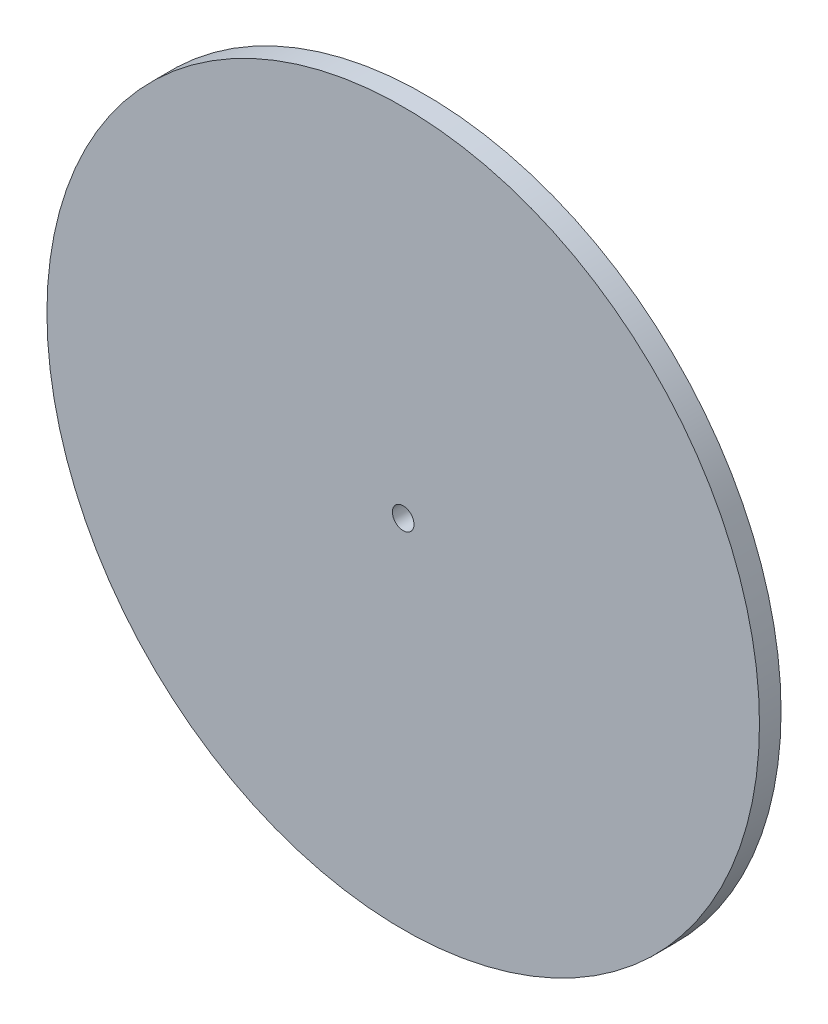
ISO-10303-21;
HEADER;
FILE_DESCRIPTION(('STEP AP214'),'2;1');
FILE_NAME('part.step','',(''),(''),'','','');
FILE_SCHEMA(('AUTOMOTIVE_DESIGN { 1 0 10303 214 1 1 1 1 }'));
ENDSEC;
DATA;
#1=APPLICATION_CONTEXT('core data for automotive mechanical design processes');
#2=APPLICATION_PROTOCOL_DEFINITION('international standard','automotive_design',2000,#1);
#3=PRODUCT_CONTEXT('',#1,'mechanical');
#4=PRODUCT('Part','Part','',(#3));
#5=PRODUCT_RELATED_PRODUCT_CATEGORY('part','',(#4));
#6=PRODUCT_DEFINITION_FORMATION('','',#4);
#7=PRODUCT_DEFINITION_CONTEXT('part definition',#1,'design');
#8=PRODUCT_DEFINITION('design','',#6,#7);
#9=PRODUCT_DEFINITION_SHAPE('','',#8);
#10=(LENGTH_UNIT() NAMED_UNIT(*) SI_UNIT(.MILLI.,.METRE.));
#11=(NAMED_UNIT(*) PLANE_ANGLE_UNIT() SI_UNIT($,.RADIAN.));
#12=(NAMED_UNIT(*) SI_UNIT($,.STERADIAN.) SOLID_ANGLE_UNIT());
#13=UNCERTAINTY_MEASURE_WITH_UNIT(LENGTH_MEASURE(1.E-05),#10,'distance_accuracy_value','');
#14=(GEOMETRIC_REPRESENTATION_CONTEXT(3) GLOBAL_UNCERTAINTY_ASSIGNED_CONTEXT((#13)) GLOBAL_UNIT_ASSIGNED_CONTEXT((#10,
#11,#12)) REPRESENTATION_CONTEXT('',''));
#15=CARTESIAN_POINT('',(0.,0.,0.));
#16=DIRECTION('',(0.,0.,1.));
#17=DIRECTION('',(1.,0.,0.));
#18=AXIS2_PLACEMENT_3D('',#15,#16,#17);
#19=CARTESIAN_POINT('',(0.,0.,10.));
#20=DIRECTION('',(0.,0.,1.));
#21=DIRECTION('',(1.,0.,0.));
#22=AXIS2_PLACEMENT_3D('',#19,#20,#21);
#23=PLANE('',#22);
#24=CARTESIAN_POINT('',(0.,0.,10.));
#25=DIRECTION('',(0.,0.,1.));
#26=DIRECTION('',(1.,0.,0.));
#27=AXIS2_PLACEMENT_3D('',#24,#25,#26);
#28=CIRCLE('',#27,165.);
#29=CARTESIAN_POINT('',(165.,0.,10.));
#30=VERTEX_POINT('',#29);
#31=EDGE_CURVE('E10',#30,#30,#28,.T.);
#32=ORIENTED_EDGE('',*,*,#31,.T.);
#33=EDGE_LOOP('',(#32));
#34=FACE_BOUND('',#33,.T.);
#35=CARTESIAN_POINT('',(0.,0.,10.));
#36=DIRECTION('',(0.,0.,1.));
#37=DIRECTION('',(1.,0.,0.));
#38=AXIS2_PLACEMENT_3D('',#35,#36,#37);
#39=CIRCLE('',#38,5.);
#40=CARTESIAN_POINT('',(5.,0.,10.));
#41=VERTEX_POINT('',#40);
#42=EDGE_CURVE('E42',#41,#41,#39,.T.);
#43=ORIENTED_EDGE('',*,*,#42,.F.);
#44=EDGE_LOOP('',(#43));
#45=FACE_BOUND('',#44,.T.);
#46=ADVANCED_FACE('F31',(#34,#45),#23,.T.);
#47=CARTESIAN_POINT('',(0.,0.,0.));
#48=DIRECTION('',(0.,0.,1.));
#49=DIRECTION('',(1.,0.,0.));
#50=AXIS2_PLACEMENT_3D('',#47,#48,#49);
#51=PLANE('',#50);
#52=CARTESIAN_POINT('',(0.,0.,0.));
#53=DIRECTION('',(0.,0.,1.));
#54=DIRECTION('',(1.,0.,0.));
#55=AXIS2_PLACEMENT_3D('',#52,#53,#54);
#56=CIRCLE('',#55,165.);
#57=CARTESIAN_POINT('',(165.,0.,0.));
#58=VERTEX_POINT('',#57);
#59=EDGE_CURVE('E35',#58,#58,#56,.T.);
#60=ORIENTED_EDGE('',*,*,#59,.F.);
#61=EDGE_LOOP('',(#60));
#62=FACE_BOUND('',#61,.T.);
#63=CARTESIAN_POINT('',(0.,0.,0.));
#64=DIRECTION('',(0.,0.,1.));
#65=DIRECTION('',(1.,0.,0.));
#66=AXIS2_PLACEMENT_3D('',#63,#64,#65);
#67=CIRCLE('',#66,5.);
#68=CARTESIAN_POINT('',(5.,0.,0.));
#69=VERTEX_POINT('',#68);
#70=EDGE_CURVE('E44',#69,#69,#67,.T.);
#71=ORIENTED_EDGE('',*,*,#70,.T.);
#72=EDGE_LOOP('',(#71));
#73=FACE_BOUND('',#72,.T.);
#74=ADVANCED_FACE('F54',(#62,#73),#51,.F.);
#75=CARTESIAN_POINT('',(0.,0.,10.));
#76=DIRECTION('',(0.,0.,-1.));
#77=DIRECTION('',(-1.,0.,0.));
#78=AXIS2_PLACEMENT_3D('',#75,#76,#77);
#79=CYLINDRICAL_SURFACE('',#78,165.);
#80=ORIENTED_EDGE('',*,*,#31,.F.);
#81=EDGE_LOOP('',(#80));
#82=FACE_BOUND('',#81,.T.);
#83=ORIENTED_EDGE('',*,*,#59,.T.);
#84=EDGE_LOOP('',(#83));
#85=FACE_BOUND('',#84,.T.);
#86=ADVANCED_FACE('F33',(#82,#85),#79,.T.);
#87=CARTESIAN_POINT('',(0.,0.,10.));
#88=DIRECTION('',(0.,0.,-1.));
#89=DIRECTION('',(-1.,0.,0.));
#90=AXIS2_PLACEMENT_3D('',#87,#88,#89);
#91=CYLINDRICAL_SURFACE('',#90,5.);
#92=ORIENTED_EDGE('',*,*,#42,.T.);
#93=EDGE_LOOP('',(#92));
#94=FACE_BOUND('',#93,.T.);
#95=ORIENTED_EDGE('',*,*,#70,.F.);
#96=EDGE_LOOP('',(#95));
#97=FACE_BOUND('',#96,.T.);
#98=ADVANCED_FACE('F50',(#94,#97),#91,.F.);
#99=CLOSED_SHELL('',(#46,#74,#86,#98));
#100=MANIFOLD_SOLID_BREP('B2',#99);
#101=ADVANCED_BREP_SHAPE_REPRESENTATION('',(#18,#100),#14);
#102=SHAPE_DEFINITION_REPRESENTATION(#9,#101);
ENDSEC;
END-ISO-10303-21;
